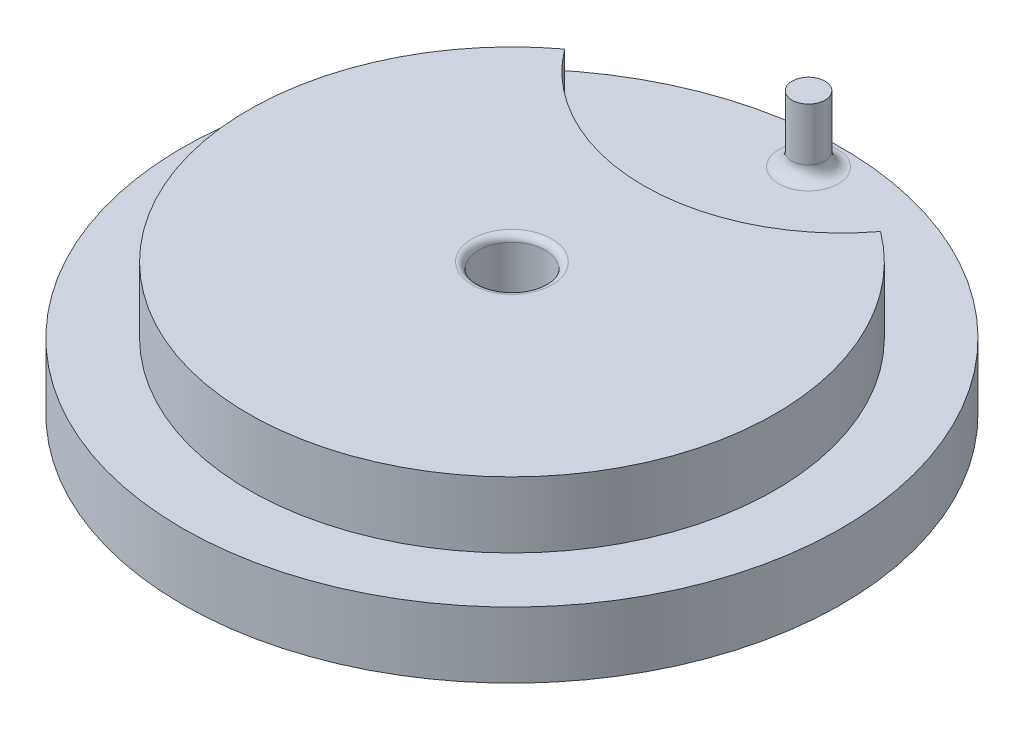
ISO-10303-21;
HEADER;
FILE_DESCRIPTION(('STEP AP214'),'2;1');
FILE_NAME('part.step','',(''),(''),'','','');
FILE_SCHEMA(('AUTOMOTIVE_DESIGN { 1 0 10303 214 1 1 1 1 }'));
ENDSEC;
DATA;
#1=APPLICATION_CONTEXT('core data for automotive mechanical design processes');
#2=APPLICATION_PROTOCOL_DEFINITION('international standard','automotive_design',2000,#1);
#3=PRODUCT_CONTEXT('',#1,'mechanical');
#4=PRODUCT('Part','Part','',(#3));
#5=PRODUCT_RELATED_PRODUCT_CATEGORY('part','',(#4));
#6=PRODUCT_DEFINITION_FORMATION('','',#4);
#7=PRODUCT_DEFINITION_CONTEXT('part definition',#1,'design');
#8=PRODUCT_DEFINITION('design','',#6,#7);
#9=PRODUCT_DEFINITION_SHAPE('','',#8);
#10=(LENGTH_UNIT() NAMED_UNIT(*) SI_UNIT(.MILLI.,.METRE.));
#11=(NAMED_UNIT(*) PLANE_ANGLE_UNIT() SI_UNIT($,.RADIAN.));
#12=(NAMED_UNIT(*) SI_UNIT($,.STERADIAN.) SOLID_ANGLE_UNIT());
#13=UNCERTAINTY_MEASURE_WITH_UNIT(LENGTH_MEASURE(1.E-05),#10,'distance_accuracy_value','');
#14=(GEOMETRIC_REPRESENTATION_CONTEXT(3) GLOBAL_UNCERTAINTY_ASSIGNED_CONTEXT((#13)) GLOBAL_UNIT_ASSIGNED_CONTEXT((#10,
#11,#12)) REPRESENTATION_CONTEXT('',''));
#15=CARTESIAN_POINT('',(0.,0.,0.));
#16=DIRECTION('',(0.,0.,1.));
#17=DIRECTION('',(1.,0.,0.));
#18=AXIS2_PLACEMENT_3D('',#15,#16,#17);
#19=CARTESIAN_POINT('',(0.,12.7,0.));
#20=DIRECTION('',(0.,1.,0.));
#21=DIRECTION('',(0.,0.,1.));
#22=AXIS2_PLACEMENT_3D('',#19,#20,#21);
#23=PLANE('',#22);
#24=CARTESIAN_POINT('',(0.,12.7,-57.15));
#25=DIRECTION('',(0.,1.,0.));
#26=DIRECTION('',(0.,0.,1.));
#27=AXIS2_PLACEMENT_3D('',#24,#25,#26);
#28=CIRCLE('',#27,5.715);
#29=CARTESIAN_POINT('',(0.,12.7,-51.435));
#30=VERTEX_POINT('',#29);
#31=EDGE_CURVE('E85',#30,#30,#28,.F.);
#32=ORIENTED_EDGE('',*,*,#31,.T.);
#33=EDGE_LOOP('',(#32));
#34=FACE_BOUND('',#33,.T.);
#35=CARTESIAN_POINT('',(0.,12.7,0.));
#36=DIRECTION('',(0.,1.,0.));
#37=DIRECTION('',(0.,0.,1.));
#38=AXIS2_PLACEMENT_3D('',#35,#36,#37);
#39=CIRCLE('',#38,63.5);
#40=CARTESIAN_POINT('',(0.,12.7,63.5));
#41=VERTEX_POINT('',#40);
#42=EDGE_CURVE('E72',#41,#41,#39,.T.);
#43=ORIENTED_EDGE('',*,*,#42,.T.);
#44=EDGE_LOOP('',(#43));
#45=FACE_BOUND('',#44,.T.);
#46=CARTESIAN_POINT('',(0.,12.7,-63.5));
#47=DIRECTION('',(0.,1.,0.));
#48=DIRECTION('',(0.,0.,1.));
#49=AXIS2_PLACEMENT_3D('',#46,#47,#48);
#50=CIRCLE('',#49,38.1);
#51=CARTESIAN_POINT('',(30.4418576666207,12.7,-40.58923175));
#52=VERTEX_POINT('',#51);
#53=CARTESIAN_POINT('',(-30.4418576666207,12.7,-40.58923175));
#54=VERTEX_POINT('',#53);
#55=EDGE_CURVE('E47',#52,#54,#50,.F.);
#56=ORIENTED_EDGE('',*,*,#55,.F.);
#57=CARTESIAN_POINT('',(0.,12.7,0.));
#58=DIRECTION('',(0.,1.,0.));
#59=DIRECTION('',(0.,0.,1.));
#60=AXIS2_PLACEMENT_3D('',#57,#58,#59);
#61=CIRCLE('',#60,50.7365);
#62=EDGE_CURVE('E69',#54,#52,#61,.T.);
#63=ORIENTED_EDGE('',*,*,#62,.F.);
#64=EDGE_LOOP('',(#56,#63));
#65=FACE_BOUND('',#64,.T.);
#66=ADVANCED_FACE('F33',(#34,#45,#65),#23,.T.);
#67=CARTESIAN_POINT('',(0.,0.,0.));
#68=DIRECTION('',(0.,1.,0.));
#69=DIRECTION('',(0.,0.,1.));
#70=AXIS2_PLACEMENT_3D('',#67,#68,#69);
#71=PLANE('',#70);
#72=CARTESIAN_POINT('',(0.,0.,0.));
#73=DIRECTION('',(0.,1.,0.));
#74=DIRECTION('',(0.,0.,1.));
#75=AXIS2_PLACEMENT_3D('',#72,#73,#74);
#76=CIRCLE('',#75,11.4935);
#77=CARTESIAN_POINT('',(0.,0.,11.4935));
#78=VERTEX_POINT('',#77);
#79=EDGE_CURVE('E88',#78,#78,#76,.T.);
#80=ORIENTED_EDGE('',*,*,#79,.T.);
#81=EDGE_LOOP('',(#80));
#82=FACE_BOUND('',#81,.T.);
#83=CARTESIAN_POINT('',(0.,0.,0.));
#84=DIRECTION('',(0.,1.,0.));
#85=DIRECTION('',(0.,0.,1.));
#86=AXIS2_PLACEMENT_3D('',#83,#84,#85);
#87=CIRCLE('',#86,63.5);
#88=CARTESIAN_POINT('',(0.,0.,63.5));
#89=VERTEX_POINT('',#88);
#90=EDGE_CURVE('E75',#89,#89,#87,.T.);
#91=ORIENTED_EDGE('',*,*,#90,.F.);
#92=EDGE_LOOP('',(#91));
#93=FACE_BOUND('',#92,.T.);
#94=ADVANCED_FACE('F109',(#82,#93),#71,.F.);
#95=CARTESIAN_POINT('',(0.,12.7,0.));
#96=DIRECTION('',(0.,-1.,0.));
#97=DIRECTION('',(0.,0.,-1.));
#98=AXIS2_PLACEMENT_3D('',#95,#96,#97);
#99=CYLINDRICAL_SURFACE('',#98,63.5);
#100=ORIENTED_EDGE('',*,*,#42,.F.);
#101=EDGE_LOOP('',(#100));
#102=FACE_BOUND('',#101,.T.);
#103=ORIENTED_EDGE('',*,*,#90,.T.);
#104=EDGE_LOOP('',(#103));
#105=FACE_BOUND('',#104,.T.);
#106=ADVANCED_FACE('F115',(#102,#105),#99,.T.);
#107=CARTESIAN_POINT('',(0.,12.7,0.));
#108=DIRECTION('',(0.,-1.,0.));
#109=DIRECTION('',(0.,0.,-1.));
#110=AXIS2_PLACEMENT_3D('',#107,#108,#109);
#111=CYLINDRICAL_SURFACE('',#110,6.4135);
#112=CARTESIAN_POINT('',(0.,24.13,0.));
#113=DIRECTION('',(0.,1.,0.));
#114=DIRECTION('',(0.,0.,1.));
#115=AXIS2_PLACEMENT_3D('',#112,#113,#114);
#116=CIRCLE('',#115,6.4135);
#117=CARTESIAN_POINT('',(0.,24.13,6.4135));
#118=VERTEX_POINT('',#117);
#119=EDGE_CURVE('E41',#118,#118,#116,.T.);
#120=ORIENTED_EDGE('',*,*,#119,.T.);
#121=EDGE_LOOP('',(#120));
#122=FACE_BOUND('',#121,.T.);
#123=CARTESIAN_POINT('',(0.,5.08,0.));
#124=DIRECTION('',(0.,1.,0.));
#125=DIRECTION('',(0.,0.,1.));
#126=AXIS2_PLACEMENT_3D('',#123,#124,#125);
#127=CIRCLE('',#126,6.4135);
#128=CARTESIAN_POINT('',(0.,5.08,6.4135));
#129=VERTEX_POINT('',#128);
#130=EDGE_CURVE('E91',#129,#129,#127,.F.);
#131=ORIENTED_EDGE('',*,*,#130,.T.);
#132=EDGE_LOOP('',(#131));
#133=FACE_BOUND('',#132,.T.);
#134=ADVANCED_FACE('F96',(#122,#133),#111,.F.);
#135=CARTESIAN_POINT('',(0.,25.4,0.));
#136=DIRECTION('',(0.,1.,0.));
#137=DIRECTION('',(0.,0.,1.));
#138=AXIS2_PLACEMENT_3D('',#135,#136,#137);
#139=PLANE('',#138);
#140=CARTESIAN_POINT('',(0.,25.4,0.));
#141=DIRECTION('',(0.,1.,0.));
#142=DIRECTION('',(0.,0.,1.));
#143=AXIS2_PLACEMENT_3D('',#140,#141,#142);
#144=CIRCLE('',#143,7.6835);
#145=CARTESIAN_POINT('',(0.,25.4,7.6835));
#146=VERTEX_POINT('',#145);
#147=EDGE_CURVE('E11',#146,#146,#144,.F.);
#148=ORIENTED_EDGE('',*,*,#147,.T.);
#149=EDGE_LOOP('',(#148));
#150=FACE_BOUND('',#149,.T.);
#151=CARTESIAN_POINT('',(0.,25.4,-63.5));
#152=DIRECTION('',(0.,1.,0.));
#153=DIRECTION('',(0.,0.,1.));
#154=AXIS2_PLACEMENT_3D('',#151,#152,#153);
#155=CIRCLE('',#154,38.1);
#156=CARTESIAN_POINT('',(-30.4418576666207,25.4,-40.58923175));
#157=VERTEX_POINT('',#156);
#158=CARTESIAN_POINT('',(30.4418576666207,25.4,-40.58923175));
#159=VERTEX_POINT('',#158);
#160=EDGE_CURVE('E64',#157,#159,#155,.T.);
#161=ORIENTED_EDGE('',*,*,#160,.F.);
#162=CARTESIAN_POINT('',(0.,25.4,0.));
#163=DIRECTION('',(0.,1.,0.));
#164=DIRECTION('',(0.,0.,1.));
#165=AXIS2_PLACEMENT_3D('',#162,#163,#164);
#166=CIRCLE('',#165,50.7365);
#167=EDGE_CURVE('E63',#157,#159,#166,.T.);
#168=ORIENTED_EDGE('',*,*,#167,.T.);
#169=EDGE_LOOP('',(#161,#168));
#170=FACE_BOUND('',#169,.T.);
#171=ADVANCED_FACE('F147',(#150,#170),#139,.T.);
#172=CARTESIAN_POINT('',(0.,25.4,0.));
#173=DIRECTION('',(0.,-1.,0.));
#174=DIRECTION('',(0.,0.,-1.));
#175=AXIS2_PLACEMENT_3D('',#172,#173,#174);
#176=CYLINDRICAL_SURFACE('',#175,50.7365);
#177=ORIENTED_EDGE('',*,*,#62,.T.);
#178=DIRECTION('',(0.,1.,0.));
#179=VECTOR('',#178,1.);
#180=CARTESIAN_POINT('',(30.4418576666207,19.05,-40.58923175));
#181=LINE('',#180,#179);
#182=EDGE_CURVE('E61',#52,#159,#181,.T.);
#183=ORIENTED_EDGE('',*,*,#182,.T.);
#184=ORIENTED_EDGE('',*,*,#167,.F.);
#185=DIRECTION('',(0.,1.,0.));
#186=VECTOR('',#185,1.);
#187=CARTESIAN_POINT('',(-30.4418576666207,19.05,-40.58923175));
#188=LINE('',#187,#186);
#189=EDGE_CURVE('E54',#157,#54,#188,.F.);
#190=ORIENTED_EDGE('',*,*,#189,.T.);
#191=EDGE_LOOP('',(#177,#183,#184,#190));
#192=FACE_BOUND('',#191,.T.);
#193=ADVANCED_FACE('F68',(#192),#176,.T.);
#194=CARTESIAN_POINT('',(0.,-95.0630734528299,-63.5));
#195=DIRECTION('',(0.,1.,0.));
#196=DIRECTION('',(0.,0.,1.));
#197=AXIS2_PLACEMENT_3D('',#194,#195,#196);
#198=CYLINDRICAL_SURFACE('',#197,38.1);
#199=ORIENTED_EDGE('',*,*,#55,.T.);
#200=ORIENTED_EDGE('',*,*,#189,.F.);
#201=ORIENTED_EDGE('',*,*,#160,.T.);
#202=ORIENTED_EDGE('',*,*,#182,.F.);
#203=EDGE_LOOP('',(#199,#200,#201,#202));
#204=FACE_BOUND('',#203,.T.);
#205=ADVANCED_FACE('F59',(#204),#198,.F.);
#206=CARTESIAN_POINT('',(0.,25.4,-57.15));
#207=DIRECTION('',(0.,-1.,0.));
#208=DIRECTION('',(0.,0.,-1.));
#209=AXIS2_PLACEMENT_3D('',#206,#207,#208);
#210=CYLINDRICAL_SURFACE('',#209,3.175);
#211=CARTESIAN_POINT('',(0.,15.24,-57.15));
#212=DIRECTION('',(0.,1.,0.));
#213=DIRECTION('',(0.,0.,1.));
#214=AXIS2_PLACEMENT_3D('',#211,#212,#213);
#215=CIRCLE('',#214,3.175);
#216=CARTESIAN_POINT('',(0.,15.24,-53.975));
#217=VERTEX_POINT('',#216);
#218=EDGE_CURVE('E82',#217,#217,#215,.T.);
#219=ORIENTED_EDGE('',*,*,#218,.T.);
#220=EDGE_LOOP('',(#219));
#221=FACE_BOUND('',#220,.T.);
#222=CARTESIAN_POINT('',(0.,25.4,-57.15));
#223=DIRECTION('',(0.,1.,0.));
#224=DIRECTION('',(0.,0.,1.));
#225=AXIS2_PLACEMENT_3D('',#222,#223,#224);
#226=CIRCLE('',#225,3.175);
#227=CARTESIAN_POINT('',(0.,25.4,-53.975));
#228=VERTEX_POINT('',#227);
#229=EDGE_CURVE('E143',#228,#228,#226,.T.);
#230=ORIENTED_EDGE('',*,*,#229,.F.);
#231=EDGE_LOOP('',(#230));
#232=FACE_BOUND('',#231,.T.);
#233=ADVANCED_FACE('F131',(#221,#232),#210,.T.);
#234=CARTESIAN_POINT('',(0.,25.4,-57.15));
#235=DIRECTION('',(0.,1.,0.));
#236=DIRECTION('',(0.,0.,1.));
#237=AXIS2_PLACEMENT_3D('',#234,#235,#236);
#238=PLANE('',#237);
#239=ORIENTED_EDGE('',*,*,#229,.T.);
#240=EDGE_LOOP('',(#239));
#241=FACE_BOUND('',#240,.T.);
#242=ADVANCED_FACE('F126',(#241),#238,.T.);
#243=CARTESIAN_POINT('',(0.,15.24,-57.15));
#244=DIRECTION('',(0.,1.,0.));
#245=DIRECTION('',(0.,0.,1.));
#246=AXIS2_PLACEMENT_3D('',#243,#244,#245);
#247=TOROIDAL_SURFACE('',#246,5.715,2.54);
#248=ORIENTED_EDGE('',*,*,#31,.F.);
#249=EDGE_LOOP('',(#248));
#250=FACE_BOUND('',#249,.T.);
#251=ORIENTED_EDGE('',*,*,#218,.F.);
#252=EDGE_LOOP('',(#251));
#253=FACE_BOUND('',#252,.T.);
#254=ADVANCED_FACE('F105',(#250,#253),#247,.F.);
#255=CARTESIAN_POINT('',(0.,5.08,0.));
#256=DIRECTION('',(0.,1.,0.));
#257=DIRECTION('',(0.,0.,1.));
#258=AXIS2_PLACEMENT_3D('',#255,#256,#257);
#259=TOROIDAL_SURFACE('',#258,11.4935,5.08);
#260=ORIENTED_EDGE('',*,*,#130,.F.);
#261=EDGE_LOOP('',(#260));
#262=FACE_BOUND('',#261,.T.);
#263=ORIENTED_EDGE('',*,*,#79,.F.);
#264=EDGE_LOOP('',(#263));
#265=FACE_BOUND('',#264,.T.);
#266=ADVANCED_FACE('F100',(#262,#265),#259,.T.);
#267=CARTESIAN_POINT('',(0.,24.13,0.));
#268=DIRECTION('',(0.,1.,0.));
#269=DIRECTION('',(0.,0.,1.));
#270=AXIS2_PLACEMENT_3D('',#267,#268,#269);
#271=TOROIDAL_SURFACE('',#270,7.6835,1.27);
#272=ORIENTED_EDGE('',*,*,#147,.F.);
#273=EDGE_LOOP('',(#272));
#274=FACE_BOUND('',#273,.T.);
#275=ORIENTED_EDGE('',*,*,#119,.F.);
#276=EDGE_LOOP('',(#275));
#277=FACE_BOUND('',#276,.T.);
#278=ADVANCED_FACE('F35',(#274,#277),#271,.T.);
#279=CLOSED_SHELL('',(#66,#94,#106,#134,#171,#193,#205,#233,#242,#254,#266,#278));
#280=MANIFOLD_SOLID_BREP('B2',#279);
#281=ADVANCED_BREP_SHAPE_REPRESENTATION('',(#18,#280),#14);
#282=SHAPE_DEFINITION_REPRESENTATION(#9,#281);
ENDSEC;
END-ISO-10303-21;
